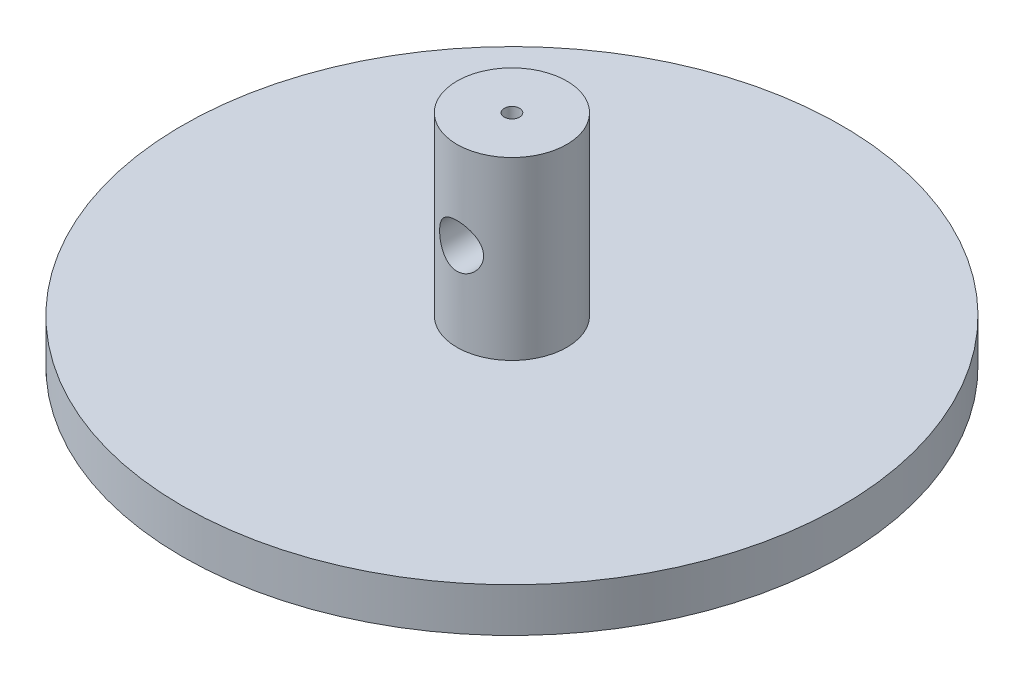
ISO-10303-21;
HEADER;
FILE_DESCRIPTION(('STEP AP214'),'2;1');
FILE_NAME('part.step','',(''),(''),'','','');
FILE_SCHEMA(('AUTOMOTIVE_DESIGN { 1 0 10303 214 1 1 1 1 }'));
ENDSEC;
DATA;
#1=APPLICATION_CONTEXT('core data for automotive mechanical design processes');
#2=APPLICATION_PROTOCOL_DEFINITION('international standard','automotive_design',2000,#1);
#3=PRODUCT_CONTEXT('',#1,'mechanical');
#4=PRODUCT('Part','Part','',(#3));
#5=PRODUCT_RELATED_PRODUCT_CATEGORY('part','',(#4));
#6=PRODUCT_DEFINITION_FORMATION('','',#4);
#7=PRODUCT_DEFINITION_CONTEXT('part definition',#1,'design');
#8=PRODUCT_DEFINITION('design','',#6,#7);
#9=PRODUCT_DEFINITION_SHAPE('','',#8);
#10=(LENGTH_UNIT() NAMED_UNIT(*) SI_UNIT(.MILLI.,.METRE.));
#11=(NAMED_UNIT(*) PLANE_ANGLE_UNIT() SI_UNIT($,.RADIAN.));
#12=(NAMED_UNIT(*) SI_UNIT($,.STERADIAN.) SOLID_ANGLE_UNIT());
#13=UNCERTAINTY_MEASURE_WITH_UNIT(LENGTH_MEASURE(1.E-05),#10,'distance_accuracy_value','');
#14=(GEOMETRIC_REPRESENTATION_CONTEXT(3) GLOBAL_UNCERTAINTY_ASSIGNED_CONTEXT((#13)) GLOBAL_UNIT_ASSIGNED_CONTEXT((#10,
#11,#12)) REPRESENTATION_CONTEXT('',''));
#15=CARTESIAN_POINT('',(0.,0.,0.));
#16=DIRECTION('',(0.,0.,1.));
#17=DIRECTION('',(1.,0.,0.));
#18=AXIS2_PLACEMENT_3D('',#15,#16,#17);
#19=CARTESIAN_POINT('',(0.,2.,0.));
#20=DIRECTION('',(0.,-1.,0.));
#21=DIRECTION('',(0.,0.,-1.));
#22=AXIS2_PLACEMENT_3D('',#19,#20,#21);
#23=CYLINDRICAL_SURFACE('',#22,15.);
#24=CARTESIAN_POINT('',(0.,2.,0.));
#25=DIRECTION('',(0.,1.,0.));
#26=DIRECTION('',(0.,0.,1.));
#27=AXIS2_PLACEMENT_3D('',#24,#25,#26);
#28=CIRCLE('',#27,15.);
#29=CARTESIAN_POINT('',(0.,2.,15.));
#30=VERTEX_POINT('',#29);
#31=EDGE_CURVE('E10',#30,#30,#28,.T.);
#32=ORIENTED_EDGE('',*,*,#31,.F.);
#33=EDGE_LOOP('',(#32));
#34=FACE_BOUND('',#33,.T.);
#35=CARTESIAN_POINT('',(0.,0.,0.));
#36=DIRECTION('',(0.,1.,0.));
#37=DIRECTION('',(0.,0.,1.));
#38=AXIS2_PLACEMENT_3D('',#35,#36,#37);
#39=CIRCLE('',#38,15.);
#40=CARTESIAN_POINT('',(0.,0.,15.));
#41=VERTEX_POINT('',#40);
#42=EDGE_CURVE('E49',#41,#41,#39,.T.);
#43=ORIENTED_EDGE('',*,*,#42,.T.);
#44=EDGE_LOOP('',(#43));
#45=FACE_BOUND('',#44,.T.);
#46=ADVANCED_FACE('F37',(#34,#45),#23,.T.);
#47=CARTESIAN_POINT('',(0.,2.,0.));
#48=DIRECTION('',(0.,1.,0.));
#49=DIRECTION('',(0.,0.,1.));
#50=AXIS2_PLACEMENT_3D('',#47,#48,#49);
#51=PLANE('',#50);
#52=CARTESIAN_POINT('',(0.,2.,0.));
#53=DIRECTION('',(0.,1.,0.));
#54=DIRECTION('',(0.,0.,1.));
#55=AXIS2_PLACEMENT_3D('',#52,#53,#54);
#56=CIRCLE('',#55,2.5);
#57=CARTESIAN_POINT('',(0.,2.,2.5));
#58=VERTEX_POINT('',#57);
#59=EDGE_CURVE('E54',#58,#58,#56,.F.);
#60=ORIENTED_EDGE('',*,*,#59,.T.);
#61=EDGE_LOOP('',(#60));
#62=FACE_BOUND('',#61,.T.);
#63=ORIENTED_EDGE('',*,*,#31,.T.);
#64=EDGE_LOOP('',(#63));
#65=FACE_BOUND('',#64,.T.);
#66=ADVANCED_FACE('F101',(#62,#65),#51,.T.);
#67=CARTESIAN_POINT('',(0.,0.,0.));
#68=DIRECTION('',(0.,1.,0.));
#69=DIRECTION('',(0.,0.,1.));
#70=AXIS2_PLACEMENT_3D('',#67,#68,#69);
#71=PLANE('',#70);
#72=ORIENTED_EDGE('',*,*,#42,.F.);
#73=EDGE_LOOP('',(#72));
#74=FACE_BOUND('',#73,.T.);
#75=ADVANCED_FACE('F96',(#74),#71,.F.);
#76=CARTESIAN_POINT('',(0.,10.,0.));
#77=DIRECTION('',(0.,-1.,0.));
#78=DIRECTION('',(0.,0.,-1.));
#79=AXIS2_PLACEMENT_3D('',#76,#77,#78);
#80=CYLINDRICAL_SURFACE('',#79,2.5);
#81=CARTESIAN_POINT('',(0.,7.,-2.5));
#82=CARTESIAN_POINT('',(-0.0537465027214457,6.99999507408814,-2.49999635613542));
#83=CARTESIAN_POINT('',(-0.107586282045337,6.99564112395581,-2.49824647153466));
#84=CARTESIAN_POINT('',(-0.213748240208948,6.97837614823938,-2.49141726550321));
#85=CARTESIAN_POINT('',(-0.266065888780624,6.96544186045693,-2.48632889349439));
#86=CARTESIAN_POINT('',(-0.367476961363702,6.93156196097058,-2.47337104606559));
#87=CARTESIAN_POINT('',(-0.41658033080848,6.91064257689163,-2.46551068182036));
#88=CARTESIAN_POINT('',(-0.510535985164184,6.86149041333673,-2.44778305398039));
#89=CARTESIAN_POINT('',(-0.555389738375496,6.83326017254053,-2.43791648729028));
#90=CARTESIAN_POINT('',(-0.641750503785197,6.76888225071953,-2.41665443085209));
#91=CARTESIAN_POINT('',(-0.683031136275107,6.73244667187987,-2.40521148464595));
#92=CARTESIAN_POINT('',(-0.759087502392362,6.65329999826161,-2.38230288453097));
#93=CARTESIAN_POINT('',(-0.793860053566767,6.61058585139413,-2.37083722226896));
#94=CARTESIAN_POINT('',(-0.85743728364644,6.51778596487887,-2.34861395898568));
#95=CARTESIAN_POINT('',(-0.885907490597737,6.4674567569884,-2.33791057982476));
#96=CARTESIAN_POINT('',(-0.933877359518575,6.36223180078998,-2.31916823593396));
#97=CARTESIAN_POINT('',(-0.953381282142918,6.30733823607582,-2.31112800622088));
#98=CARTESIAN_POINT('',(-0.981949411697935,6.19714383320395,-2.29913178830409));
#99=CARTESIAN_POINT('',(-0.991446982902825,6.14197438221189,-2.29500710177802));
#100=CARTESIAN_POINT('',(-1.00108648082002,6.03068250084637,-2.29082002024572));
#101=CARTESIAN_POINT('',(-1.00123300815661,5.97456055268749,-2.29075562761384));
#102=CARTESIAN_POINT('',(-0.992494683752273,5.86712166427098,-2.29455250139997));
#103=CARTESIAN_POINT('',(-0.98423765715257,5.81574214279548,-2.29814087519225));
#104=CARTESIAN_POINT('',(-0.959973440148911,5.71517022199664,-2.30838093803918));
#105=CARTESIAN_POINT('',(-0.943964897402317,5.66597820594485,-2.31503316160836));
#106=CARTESIAN_POINT('',(-0.904347366275537,5.56999108190198,-2.33079742544265));
#107=CARTESIAN_POINT('',(-0.880589931157659,5.52326538047265,-2.33995689640394));
#108=CARTESIAN_POINT('',(-0.826253230366108,5.43429209181922,-2.35969058194945));
#109=CARTESIAN_POINT('',(-0.795671402550423,5.3920461952986,-2.37026532728424));
#110=CARTESIAN_POINT('',(-0.725775299727218,5.309795135599,-2.39263368371135));
#111=CARTESIAN_POINT('',(-0.685968731485319,5.27021563527699,-2.40445832488076));
#112=CARTESIAN_POINT('',(-0.600157213715098,5.19815776099898,-2.42729912479141));
#113=CARTESIAN_POINT('',(-0.554151032667218,5.16568080129485,-2.43831512222662));
#114=CARTESIAN_POINT('',(-0.456038826302923,5.10819127629208,-2.45857340632274));
#115=CARTESIAN_POINT('',(-0.40383024567324,5.08333885940147,-2.46777635047707));
#116=CARTESIAN_POINT('',(-0.295511882741443,5.04291606946097,-2.48307414164379));
#117=CARTESIAN_POINT('',(-0.239404098424839,5.02734098122129,-2.48917056731191));
#118=CARTESIAN_POINT('',(-0.128447943803912,5.00677585229015,-2.49728069753455));
#119=CARTESIAN_POINT('',(-0.0737216469927692,5.00121377287322,-2.49951472916757));
#120=CARTESIAN_POINT('',(0.0359226549039067,4.99914344973569,-2.50034239255315));
#121=CARTESIAN_POINT('',(0.0908406066119599,5.00263285922625,-2.49893696791146));
#122=CARTESIAN_POINT('',(0.196716369560992,5.018145876276,-2.49278783531877));
#123=CARTESIAN_POINT('',(0.247741245887735,5.02977899017549,-2.48819695672762));
#124=CARTESIAN_POINT('',(0.347067714030388,5.06071785415491,-2.4762972070275));
#125=CARTESIAN_POINT('',(0.39536895511242,5.08002458983434,-2.46898798678265));
#126=CARTESIAN_POINT('',(0.489539392908349,5.12639246983997,-2.45208297385406));
#127=CARTESIAN_POINT('',(0.535289011377701,5.15367273602157,-2.44242407989902));
#128=CARTESIAN_POINT('',(0.621721795623276,5.21497016195282,-2.42186682372762));
#129=CARTESIAN_POINT('',(0.662402920380561,5.24899002146131,-2.41096796555135));
#130=CARTESIAN_POINT('',(0.740361521514408,5.32543500647481,-2.38822558819056));
#131=CARTESIAN_POINT('',(0.777236966903031,5.3682667707531,-2.37636720712526));
#132=CARTESIAN_POINT('',(0.843375598706854,5.45972004150468,-2.35370836458566));
#133=CARTESIAN_POINT('',(0.872637530668753,5.50834250016997,-2.34290807763255));
#134=CARTESIAN_POINT('',(0.922903750965812,5.61073084729705,-2.32357149953854));
#135=CARTESIAN_POINT('',(0.943825297267225,5.66454199960615,-2.31505815442394));
#136=CARTESIAN_POINT('',(0.976148109852651,5.77536682585758,-2.30161836738966));
#137=CARTESIAN_POINT('',(0.987556402634656,5.83237810290621,-2.29668927847999));
#138=CARTESIAN_POINT('',(0.999857808639199,5.94356395088727,-2.29135879649963));
#139=CARTESIAN_POINT('',(1.00144854115143,5.99764741979667,-2.29065710504086));
#140=CARTESIAN_POINT('',(0.995901579638761,6.10527242885664,-2.29307418016549));
#141=CARTESIAN_POINT('',(0.98876499395689,6.15881403695129,-2.29619246162397));
#142=CARTESIAN_POINT('',(0.966535683076823,6.26166609492752,-2.3056332453951));
#143=CARTESIAN_POINT('',(0.951768746785488,6.3110601372165,-2.31182415913725));
#144=CARTESIAN_POINT('',(0.915002724245506,6.40668931480674,-2.32662000616348));
#145=CARTESIAN_POINT('',(0.893001640696906,6.45292357344991,-2.33522560603003));
#146=CARTESIAN_POINT('',(0.840936381379865,6.54380480963539,-2.35449304802246));
#147=CARTESIAN_POINT('',(0.810482667579744,6.58820933506524,-2.36524441156621));
#148=CARTESIAN_POINT('',(0.742946059635747,6.67149665860188,-2.38731902186119));
#149=CARTESIAN_POINT('',(0.70586116740906,6.71037778606416,-2.39864244024203));
#150=CARTESIAN_POINT('',(0.623252753136231,6.78410142663181,-2.42146783543697));
#151=CARTESIAN_POINT('',(0.577338000573069,6.81851865344903,-2.43293378981093));
#152=CARTESIAN_POINT('',(0.479950160142889,6.87916852131082,-2.45400203356858));
#153=CARTESIAN_POINT('',(0.428474502273618,6.90539735607626,-2.46360345546453));
#154=CARTESIAN_POINT('',(0.322369031247601,6.94831110759514,-2.47969857407931));
#155=CARTESIAN_POINT('',(0.267815809109848,6.96516466178017,-2.48624681527514));
#156=CARTESIAN_POINT('',(0.15643827314061,6.98931956047713,-2.49572153104683));
#157=CARTESIAN_POINT('',(0.099621762929456,6.99665121837195,-2.49865949747819));
#158=CARTESIAN_POINT('',(0.0284561489454646,6.99969769048914,-2.49987949752068));
#159=CARTESIAN_POINT('',(0.0142313443703791,7.0000013043146,-2.50000096484588));
#160=CARTESIAN_POINT('',(0.,7.,-2.5));
#161=B_SPLINE_CURVE_WITH_KNOTS('',3,(#81,#82,#83,#84,#85,#86,#87,#88,#89,#90,#91,#92,#93,#94,
#95,#96,#97,#98,#99,#100,#101,#102,#103,#104,#105,#106,#107,#108,#109,#110,#111,#112,#113,#114,
#115,#116,#117,#118,#119,#120,#121,#122,#123,#124,#125,#126,#127,#128,#129,#130,#131,#132,#133,
#134,#135,#136,#137,#138,#139,#140,#141,#142,#143,#144,#145,#146,#147,#148,#149,#150,#151,#152,
#153,#154,#155,#156,#157,#158,#159,#160),.UNSPECIFIED.,.T.,.F.,(4,2,2,2,2,2,2,2,2,2,2,2,2,2,2,2,
2,2,2,2,2,2,2,2,2,2,2,2,2,2,2,2,2,2,2,2,2,2,2,4),(0.,0.161201493946536,0.322841818003967,
0.483955728735791,0.645013767839922,0.812986908501986,0.981041974672058,1.15657629409608,
1.33202711559134,1.49952052654414,1.66693153170244,1.82269164200686,1.97847893628024,
2.13744563149408,2.29647210969092,2.46779174593278,2.63914546419866,2.81388456581403,
2.98853478056895,3.15284592264004,3.31711446785041,3.47400227782183,3.63091024496898,
3.79261756699131,3.95438979749484,4.12684237312207,4.29932334521874,4.47347522570414,
4.64749836322967,4.80899836696374,4.97047786281523,5.12557159274384,5.28070817902581,
5.44472734028346,5.60879600674197,5.78350211766918,5.95828931820266,6.12982150506659,
6.30080626202171,6.34349022948398),.UNSPECIFIED.);
#162=CARTESIAN_POINT('',(0.,7.,-2.5));
#163=VERTEX_POINT('',#162);
#164=EDGE_CURVE('E64',#163,#163,#161,.T.);
#165=ORIENTED_EDGE('',*,*,#164,.T.);
#166=EDGE_LOOP('',(#165));
#167=FACE_BOUND('',#166,.T.);
#168=CARTESIAN_POINT('',(0.999999999999999,6.,2.29128784747792));
#169=CARTESIAN_POINT('',(0.999994127101893,5.94643025095005,2.29129325828211));
#170=CARTESIAN_POINT('',(0.995669909297175,5.89278473264765,2.29319301242133));
#171=CARTESIAN_POINT('',(0.978534515296364,5.78703258356146,2.30055457093923));
#172=CARTESIAN_POINT('',(0.965701652221064,5.73493024145976,2.30602547693426));
#173=CARTESIAN_POINT('',(0.932117516284351,5.63397352901497,2.31980227895648));
#174=CARTESIAN_POINT('',(0.911396076262711,5.58510772631987,2.32809748178557));
#175=CARTESIAN_POINT('',(0.862710134685804,5.49155747457019,2.3465733254764));
#176=CARTESIAN_POINT('',(0.834747214633749,5.44687211542457,2.35675355451962));
#177=CARTESIAN_POINT('',(0.770660987293709,5.36036979887927,2.37850432525516));
#178=CARTESIAN_POINT('',(0.734189678863663,5.31882178853527,2.39011958979373));
#179=CARTESIAN_POINT('',(0.654854552887021,5.24223550134231,2.41306228489405));
#180=CARTESIAN_POINT('',(0.61198851083784,5.20719949935507,2.42438961368186));
#181=CARTESIAN_POINT('',(0.519003155178188,5.14329680150865,2.44601703953427));
#182=CARTESIAN_POINT('',(0.46866448280614,5.11472784926468,2.45625901841784));
#183=CARTESIAN_POINT('',(0.363412661437559,5.0665782158051,2.47401963815773));
#184=CARTESIAN_POINT('',(0.30850138464398,5.04699387710902,2.48153938692337));
#185=CARTESIAN_POINT('',(0.198483213419445,5.0183292567813,2.49269162504143));
#186=CARTESIAN_POINT('',(0.143514492402302,5.00878634295549,2.49649468387678));
#187=CARTESIAN_POINT('',(0.0326331643188248,4.99898575716865,2.50040155341352));
#188=CARTESIAN_POINT('',(-0.0232790829127022,4.99872462203258,2.50050674384656));
#189=CARTESIAN_POINT('',(-0.131116247357657,5.00724138488749,2.49710981410893));
#190=CARTESIAN_POINT('',(-0.183088726437018,5.01551238637346,2.49380998385918));
#191=CARTESIAN_POINT('',(-0.28483655460917,5.03999643815538,2.48424645734395));
#192=CARTESIAN_POINT('',(-0.33461174219508,5.05621007120019,2.47798254360556));
#193=CARTESIAN_POINT('',(-0.431448969255829,5.09631824143815,2.4629841222885));
#194=CARTESIAN_POINT('',(-0.478458811689817,5.12032485740776,2.454213802334));
#195=CARTESIAN_POINT('',(-0.567904075370288,5.1752325034595,2.43507292589849));
#196=CARTESIAN_POINT('',(-0.610337921358055,5.20613589654881,2.42470182132537));
#197=CARTESIAN_POINT('',(-0.692384413996077,5.2763245679733,2.40260818589167));
#198=CARTESIAN_POINT('',(-0.731628922636822,5.31602694629191,2.3908416326012));
#199=CARTESIAN_POINT('',(-0.803053707692664,5.40149528591048,2.36780830482389));
#200=CARTESIAN_POINT('',(-0.835231671879829,5.44726322407708,2.35654169488174));
#201=CARTESIAN_POINT('',(-0.892452094371467,5.54520951120447,2.33548448720906));
#202=CARTESIAN_POINT('',(-0.917267325867453,5.59753241524191,2.3257445709069));
#203=CARTESIAN_POINT('',(-0.957588129983134,5.706107745231,2.30943795233662));
#204=CARTESIAN_POINT('',(-0.9730997492022,5.76235759238542,2.3028691896167));
#205=CARTESIAN_POINT('',(-0.99347747441598,5.87351788871802,2.29414879836282));
#206=CARTESIAN_POINT('',(-0.998936048404206,5.92830022356008,2.29175183224038));
#207=CARTESIAN_POINT('',(-1.00078066322451,6.03803860388397,2.29094748938549));
#208=CARTESIAN_POINT('',(-0.997169455296443,6.09299459163892,2.29253890281231));
#209=CARTESIAN_POINT('',(-0.981516447394263,6.19822946747744,2.29928022178566));
#210=CARTESIAN_POINT('',(-0.969966531011729,6.24859646869975,2.30422228898885));
#211=CARTESIAN_POINT('',(-0.939402093455639,6.346644202393,2.31685025513936));
#212=CARTESIAN_POINT('',(-0.920385917151197,6.39432433655365,2.32453676244372));
#213=CARTESIAN_POINT('',(-0.874567819740728,6.48780117889774,2.34216890929975));
#214=CARTESIAN_POINT('',(-0.847481434132298,6.53344309434723,2.35219352319567));
#215=CARTESIAN_POINT('',(-0.786582612220938,6.61974149372083,2.37325192578919));
#216=CARTESIAN_POINT('',(-0.752767436740992,6.6603959363978,2.38428612448031));
#217=CARTESIAN_POINT('',(-0.676422105840242,6.73868670429961,2.40710457985699));
#218=CARTESIAN_POINT('',(-0.63343271472255,6.77587828264551,2.41888403642601));
#219=CARTESIAN_POINT('',(-0.541541816684423,6.84258853830517,2.44109897283781));
#220=CARTESIAN_POINT('',(-0.492640069233932,6.87210690329862,2.4515343979662));
#221=CARTESIAN_POINT('',(-0.390139967000881,6.92252381323061,2.46991857950143));
#222=CARTESIAN_POINT('',(-0.336542740497034,6.94342442208289,2.47786793120137));
#223=CARTESIAN_POINT('',(-0.226196795459613,6.97577442620381,2.49036356734645));
#224=CARTESIAN_POINT('',(-0.169449805147136,6.98722895072003,2.49491169853772));
#225=CARTESIAN_POINT('',(-0.0584082551731529,6.99975235081269,2.49989504105256));
#226=CARTESIAN_POINT('',(-0.00419524629652924,7.00145006423132,2.50057923372437));
#227=CARTESIAN_POINT('',(0.10371691786662,6.99607226035795,2.49843021189296));
#228=CARTESIAN_POINT('',(0.15741614969731,6.98899807110719,2.49559752983456));
#229=CARTESIAN_POINT('',(0.261085450973204,6.96672660582076,2.48685756682127));
#230=CARTESIAN_POINT('',(0.311119402324192,6.95178552696222,2.48104740317165));
#231=CARTESIAN_POINT('',(0.407961177379469,6.91447359771909,2.46697473916019));
#232=CARTESIAN_POINT('',(0.454768404133637,6.89210137698983,2.45871178652006));
#233=CARTESIAN_POINT('',(0.546101520928056,6.83944840075533,2.44009047180029));
#234=CARTESIAN_POINT('',(0.590435193403211,6.80886185255746,2.42965564864115));
#235=CARTESIAN_POINT('',(0.673527014262034,6.74110574041053,2.40794701593224));
#236=CARTESIAN_POINT('',(0.712282842872876,6.70393345176994,2.3966728602525));
#237=CARTESIAN_POINT('',(0.785600632542994,6.62134238773748,2.37368881779711));
#238=CARTESIAN_POINT('',(0.819754443599513,6.57555556329945,2.36199516302692));
#239=CARTESIAN_POINT('',(0.879923725219698,6.47852893128562,2.3402483573759));
#240=CARTESIAN_POINT('',(0.905938238949993,6.42728848354507,2.33019539943728));
#241=CARTESIAN_POINT('',(0.946995543836654,6.32548139907596,2.31379432228954));
#242=CARTESIAN_POINT('',(0.962813757082102,6.27526738262441,2.30719459305824));
#243=CARTESIAN_POINT('',(0.986358878909191,6.17275729018483,2.29723001801982));
#244=CARTESIAN_POINT('',(0.994108333944006,6.12046744201652,2.29385616036088));
#245=CARTESIAN_POINT('',(0.999232129155085,6.04531121883103,2.29162229378817));
#246=CARTESIAN_POINT('',(1.00000248449744,6.0226623895012,2.29128555846679));
#247=CARTESIAN_POINT('',(0.999999999999999,6.,2.29128784747792));
#248=B_SPLINE_CURVE_WITH_KNOTS('',3,(#168,#169,#170,#171,#172,#173,#174,#175,#176,#177,#178,
#179,#180,#181,#182,#183,#184,#185,#186,#187,#188,#189,#190,#191,#192,#193,#194,#195,#196,#197,
#198,#199,#200,#201,#202,#203,#204,#205,#206,#207,#208,#209,#210,#211,#212,#213,#214,#215,#216,
#217,#218,#219,#220,#221,#222,#223,#224,#225,#226,#227,#228,#229,#230,#231,#232,#233,#234,#235,
#236,#237,#238,#239,#240,#241,#242,#243,#244,#245,#246,#247),.UNSPECIFIED.,.T.,.F.,(4,2,2,2,2,2,
2,2,2,2,2,2,2,2,2,2,2,2,2,2,2,2,2,2,2,2,2,2,2,2,2,2,2,2,2,2,2,2,2,4),(0.,0.160638824383827,
0.321688667911123,0.482135411646695,0.642547144119307,0.811278091422122,0.980067871741711,
1.15551334545714,1.3308873348474,1.49777091443592,1.66459222652836,1.82204322415151,
1.9795057756453,2.13934150117449,2.29923207470016,2.46962022040678,2.64006403563563,
2.81532229357288,2.99046652397056,3.15491073759215,3.31930507450975,3.47433624039577,
3.62940179322824,3.79075577323356,3.9521755725993,4.12551867120495,4.29886882423379,
4.47217743653411,4.64539187974073,4.80730519874981,4.96919400753306,5.12610997218681,
5.28305488911298,5.44693525566967,5.61088358279108,5.78498126639812,5.95909940876599,
6.11758330406543,6.27562315106627,6.34358052760367),.UNSPECIFIED.);
#249=CARTESIAN_POINT('',(0.999999999999999,6.,2.29128784747792));
#250=VERTEX_POINT('',#249);
#251=EDGE_CURVE('E71',#250,#250,#248,.T.);
#252=ORIENTED_EDGE('',*,*,#251,.T.);
#253=EDGE_LOOP('',(#252));
#254=FACE_BOUND('',#253,.T.);
#255=ORIENTED_EDGE('',*,*,#59,.F.);
#256=EDGE_LOOP('',(#255));
#257=FACE_BOUND('',#256,.T.);
#258=CARTESIAN_POINT('',(0.,10.,0.));
#259=DIRECTION('',(0.,1.,0.));
#260=DIRECTION('',(0.,0.,1.));
#261=AXIS2_PLACEMENT_3D('',#258,#259,#260);
#262=CIRCLE('',#261,2.5);
#263=CARTESIAN_POINT('',(0.,10.,2.5));
#264=VERTEX_POINT('',#263);
#265=EDGE_CURVE('E58',#264,#264,#262,.T.);
#266=ORIENTED_EDGE('',*,*,#265,.F.);
#267=EDGE_LOOP('',(#266));
#268=FACE_BOUND('',#267,.T.);
#269=ADVANCED_FACE('F75',(#167,#254,#257,#268),#80,.T.);
#270=CARTESIAN_POINT('',(0.,10.,0.));
#271=DIRECTION('',(0.,1.,0.));
#272=DIRECTION('',(0.,0.,1.));
#273=AXIS2_PLACEMENT_3D('',#270,#271,#272);
#274=PLANE('',#273);
#275=CARTESIAN_POINT('',(0.,10.,0.));
#276=DIRECTION('',(0.,1.,0.));
#277=DIRECTION('',(0.,0.,1.));
#278=AXIS2_PLACEMENT_3D('',#275,#276,#277);
#279=CIRCLE('',#278,0.35);
#280=CARTESIAN_POINT('',(0.,10.,0.35));
#281=VERTEX_POINT('',#280);
#282=EDGE_CURVE('E61',#281,#281,#279,.T.);
#283=ORIENTED_EDGE('',*,*,#282,.F.);
#284=EDGE_LOOP('',(#283));
#285=FACE_BOUND('',#284,.T.);
#286=ORIENTED_EDGE('',*,*,#265,.T.);
#287=EDGE_LOOP('',(#286));
#288=FACE_BOUND('',#287,.T.);
#289=ADVANCED_FACE('F88',(#285,#288),#274,.T.);
#290=CARTESIAN_POINT('',(0.,6.,0.));
#291=DIRECTION('',(0.,1.,0.));
#292=DIRECTION('',(0.,0.,1.));
#293=AXIS2_PLACEMENT_3D('',#290,#291,#292);
#294=CYLINDRICAL_SURFACE('',#293,0.35);
#295=CARTESIAN_POINT('',(0.,7.,0.35));
#296=CARTESIAN_POINT('',(-0.0190419365667704,7.0000002074662,0.35000029566494));
#297=CARTESIAN_POINT('',(-0.0380817621605742,6.99945119778716,0.348441032859464));
#298=CARTESIAN_POINT('',(-0.0755973359168907,6.99731545425018,0.342266620683781));
#299=CARTESIAN_POINT('',(-0.0940730815616028,6.99572871576099,0.337651457675488));
#300=CARTESIAN_POINT('',(-0.12991423560161,6.99168912692243,0.3255451061498));
#301=CARTESIAN_POINT('',(-0.14728154937581,6.98923781286422,0.318059017022754));
#302=CARTESIAN_POINT('',(-0.180513664529482,6.98371689973122,0.300447488873608));
#303=CARTESIAN_POINT('',(-0.196378123246308,6.98064716014708,0.290321449887713));
#304=CARTESIAN_POINT('',(-0.226752589205332,6.97408061736121,0.267317148434886));
#305=CARTESIAN_POINT('',(-0.241198196476064,6.97057284178044,0.2543570081776));
#306=CARTESIAN_POINT('',(-0.267761185151237,6.96358339494058,0.226226333105416));
#307=CARTESIAN_POINT('',(-0.279877980872923,6.9601017304593,0.211055243931873));
#308=CARTESIAN_POINT('',(-0.301822956436175,6.95343535422635,0.178334535043532));
#309=CARTESIAN_POINT('',(-0.311564633061965,6.95026385616978,0.1607239441518));
#310=CARTESIAN_POINT('',(-0.327919932284169,6.94474524429607,0.123985540973157));
#311=CARTESIAN_POINT('',(-0.334534622117332,6.94239784928407,0.104858248940901));
#312=CARTESIAN_POINT('',(-0.344201639327244,6.93890943653321,0.066365696729921));
#313=CARTESIAN_POINT('',(-0.347375567156981,6.93772738339174,0.0470348102691697));
#314=CARTESIAN_POINT('',(-0.350451197776511,6.93658257252681,0.00808148808750199));
#315=CARTESIAN_POINT('',(-0.350354037654174,6.93661939110197,-0.0115408439509378));
#316=CARTESIAN_POINT('',(-0.346984099900023,6.9378724266793,-0.0494549458865224));
#317=CARTESIAN_POINT('',(-0.343873715102305,6.93902833039445,-0.0677634980276158));
#318=CARTESIAN_POINT('',(-0.334831908312514,6.94229000459414,-0.10358024062957));
#319=CARTESIAN_POINT('',(-0.328900115780654,6.94439589984065,-0.121088325632715));
#320=CARTESIAN_POINT('',(-0.314284371092289,6.94936061069948,-0.155161236677744));
#321=CARTESIAN_POINT('',(-0.305554665446364,6.95223179925247,-0.17170455513481));
#322=CARTESIAN_POINT('',(-0.285622688503032,6.95839881288886,-0.203141194898522));
#323=CARTESIAN_POINT('',(-0.274419646122698,6.96169477026371,-0.218033999464404));
#324=CARTESIAN_POINT('',(-0.249093399518622,6.96857324131152,-0.246654322836934));
#325=CARTESIAN_POINT('',(-0.234838607842065,6.97216129324396,-0.260264324954869));
#326=CARTESIAN_POINT('',(-0.20420568472556,6.97905374080449,-0.284932987188913));
#327=CARTESIAN_POINT('',(-0.187827306050331,6.98235810332991,-0.295991349817061));
#328=CARTESIAN_POINT('',(-0.153143472911848,6.98836231336614,-0.31535059912541));
#329=CARTESIAN_POINT('',(-0.13481738034104,6.99105448799454,-0.323617056244515));
#330=CARTESIAN_POINT('',(-0.0969175142974282,6.99547488235365,-0.33691223068665));
#331=CARTESIAN_POINT('',(-0.0773442238836901,6.99720347279692,-0.34194219327716));
#332=CARTESIAN_POINT('',(-0.0384982043681415,6.99943906016286,-0.348406581342177));
#333=CARTESIAN_POINT('',(-0.0192549298626998,6.99999988916544,-0.349999580651892));
#334=CARTESIAN_POINT('',(0.0192296486438425,7.00000011069648,-0.35000041893421));
#335=CARTESIAN_POINT('',(0.0384709523316233,6.99943971480848,-0.348408858857029));
#336=CARTESIAN_POINT('',(0.0757512294713587,6.99729603232044,-0.342209465009631));
#337=CARTESIAN_POINT('',(0.0938089527398938,6.99574663082445,-0.33770148622663));
#338=CARTESIAN_POINT('',(0.128902504417681,6.99181459010911,-0.325924618509959));
#339=CARTESIAN_POINT('',(0.145938200269845,6.98943184307726,-0.318655372332123));
#340=CARTESIAN_POINT('',(0.179030679460621,6.98399042528823,-0.301340991136805));
#341=CARTESIAN_POINT('',(0.195047324127531,6.9809148734336,-0.291224601529463));
#342=CARTESIAN_POINT('',(0.225205778758283,6.97443351746495,-0.26858548204287));
#343=CARTESIAN_POINT('',(0.239346963572292,6.97102760388267,-0.256061953178293));
#344=CARTESIAN_POINT('',(0.266095315380713,6.96405083973233,-0.228219979837874));
#345=CARTESIAN_POINT('',(0.278589451163017,6.96048031561228,-0.212792589199569));
#346=CARTESIAN_POINT('',(0.3008287426245,6.95374917865966,-0.179985410062765));
#347=CARTESIAN_POINT('',(0.310573801852747,6.95058858021136,-0.162605553092189));
#348=CARTESIAN_POINT('',(0.327010981482503,6.94506055506595,-0.126333270971916));
#349=CARTESIAN_POINT('',(0.333703039747182,6.94269314451262,-0.107440815045935));
#350=CARTESIAN_POINT('',(0.34377516620245,6.93906754243302,-0.0686934545767531));
#351=CARTESIAN_POINT('',(0.347156933806813,6.93780878178915,-0.0488390493725747));
#352=CARTESIAN_POINT('',(0.350371939292429,6.93661206105014,-0.00993796785778259));
#353=CARTESIAN_POINT('',(0.350394730781542,6.93660354718167,0.00909102965378848));
#354=CARTESIAN_POINT('',(0.347365100025331,6.93773132726507,0.0468662623066787));
#355=CARTESIAN_POINT('',(0.344312898727907,6.9388675389648,0.065612517665684));
#356=CARTESIAN_POINT('',(0.335359653137508,6.94210169389743,0.101855095878646));
#357=CARTESIAN_POINT('',(0.329526105721829,6.94417679451213,0.119370296669218));
#358=CARTESIAN_POINT('',(0.315232119578902,6.94904448969209,0.15318580947952));
#359=CARTESIAN_POINT('',(0.306771062677341,6.95183725307521,0.169485834484501));
#360=CARTESIAN_POINT('',(0.286997020698531,6.95798987568256,0.201243457539566));
#361=CARTESIAN_POINT('',(0.275568240723685,6.96137028499104,0.216624940020237));
#362=CARTESIAN_POINT('',(0.250372401134085,6.96823756146895,0.245312762868262));
#363=CARTESIAN_POINT('',(0.236604648644053,6.97172445993194,0.258618486085177));
#364=CARTESIAN_POINT('',(0.206385316503675,6.97859866952652,0.283378378171431));
#365=CARTESIAN_POINT('',(0.189841397862822,6.98197459556953,0.294723445050951));
#366=CARTESIAN_POINT('',(0.154966762908334,6.98807802617174,0.314462349527952));
#367=CARTESIAN_POINT('',(0.136636283652995,6.99080561659372,0.32285657799237));
#368=CARTESIAN_POINT('',(0.0989029837726596,6.99527628101645,0.33632572190412));
#369=CARTESIAN_POINT('',(0.0795139546253167,6.99702971508065,0.34143566085701));
#370=CARTESIAN_POINT('',(0.0400823491605334,6.99939126371605,0.348272048500515));
#371=CARTESIAN_POINT('',(0.020040005549011,6.99999978165961,0.349999688838002));
#372=CARTESIAN_POINT('',(0.,7.,0.35));
#373=B_SPLINE_CURVE_WITH_KNOTS('',3,(#295,#296,#297,#298,#299,#300,#301,#302,#303,#304,#305,
#306,#307,#308,#309,#310,#311,#312,#313,#314,#315,#316,#317,#318,#319,#320,#321,#322,#323,#324,
#325,#326,#327,#328,#329,#330,#331,#332,#333,#334,#335,#336,#337,#338,#339,#340,#341,#342,#343,
#344,#345,#346,#347,#348,#349,#350,#351,#352,#353,#354,#355,#356,#357,#358,#359,#360,#361,#362,
#363,#364,#365,#366,#367,#368,#369,#370,#371,#372),.UNSPECIFIED.,.T.,.F.,(4,2,2,2,2,2,2,2,2,2,2,
2,2,2,2,2,2,2,2,2,2,2,2,2,2,2,2,2,2,2,2,2,2,2,2,2,2,2,4),(0.,0.0570519944031418,
0.114104243423654,0.171055621088201,0.228019953012127,0.286921290102947,0.345837421214186,
0.406655384480435,0.467452575637787,0.526023033896815,0.584573132241702,0.640133800495416,
0.695701767632169,0.752229237958946,0.80877435613459,0.868595781337538,0.928424177420227,
0.988965514200254,1.04948354325972,1.10714375539055,1.16479308763354,1.22056613706353,
1.27634640469574,1.33367037766896,1.3910134107584,1.45124257559362,1.51147385329718,
1.57170635681553,1.63190792235164,1.68871081571932,1.74550962791159,1.80099524927407,
1.85649393464463,1.91461307080426,1.97274945374825,2.03347978031913,2.09420205954011,
2.15426555721711,2.21430788959292),.UNSPECIFIED.);
#374=CARTESIAN_POINT('',(0.,7.,0.35));
#375=VERTEX_POINT('',#374);
#376=EDGE_CURVE('E40',#375,#375,#373,.T.);
#377=ORIENTED_EDGE('',*,*,#376,.T.);
#378=EDGE_LOOP('',(#377));
#379=FACE_BOUND('',#378,.T.);
#380=ORIENTED_EDGE('',*,*,#282,.T.);
#381=EDGE_LOOP('',(#380));
#382=FACE_BOUND('',#381,.T.);
#383=ADVANCED_FACE('F82',(#379,#382),#294,.F.);
#384=CARTESIAN_POINT('',(0.,6.,-15.));
#385=DIRECTION('',(0.,0.,1.));
#386=DIRECTION('',(1.,0.,0.));
#387=AXIS2_PLACEMENT_3D('',#384,#385,#386);
#388=CYLINDRICAL_SURFACE('',#387,1.);
#389=ORIENTED_EDGE('',*,*,#251,.F.);
#390=EDGE_LOOP('',(#389));
#391=FACE_BOUND('',#390,.T.);
#392=ORIENTED_EDGE('',*,*,#376,.F.);
#393=EDGE_LOOP('',(#392));
#394=FACE_BOUND('',#393,.T.);
#395=ORIENTED_EDGE('',*,*,#164,.F.);
#396=EDGE_LOOP('',(#395));
#397=FACE_BOUND('',#396,.T.);
#398=ADVANCED_FACE('F79',(#391,#394,#397),#388,.F.);
#399=CLOSED_SHELL('',(#46,#66,#75,#269,#289,#383,#398));
#400=MANIFOLD_SOLID_BREP('B2',#399);
#401=ADVANCED_BREP_SHAPE_REPRESENTATION('',(#18,#400),#14);
#402=SHAPE_DEFINITION_REPRESENTATION(#9,#401);
ENDSEC;
END-ISO-10303-21;
